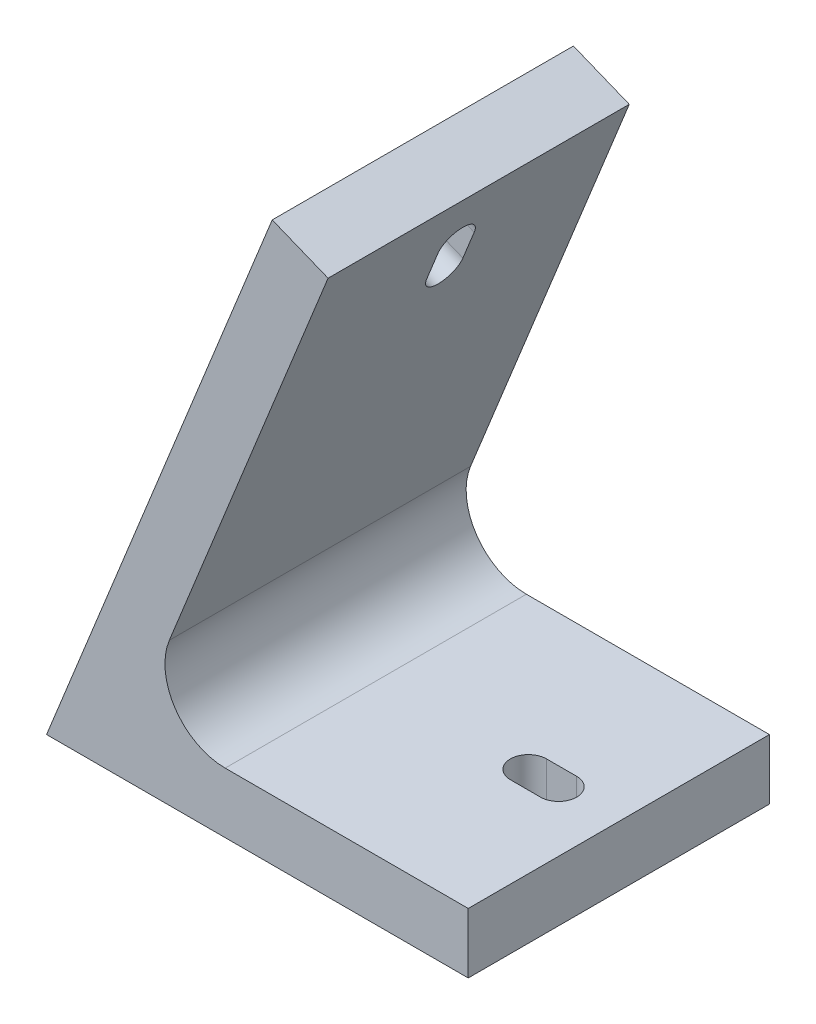
ISO-10303-21;
HEADER;
FILE_DESCRIPTION(('STEP AP214'),'2;1');
FILE_NAME('part.step','',(''),(''),'','','');
FILE_SCHEMA(('AUTOMOTIVE_DESIGN { 1 0 10303 214 1 1 1 1 }'));
ENDSEC;
DATA;
#1=APPLICATION_CONTEXT('core data for automotive mechanical design processes');
#2=APPLICATION_PROTOCOL_DEFINITION('international standard','automotive_design',2000,#1);
#3=PRODUCT_CONTEXT('',#1,'mechanical');
#4=PRODUCT('Part','Part','',(#3));
#5=PRODUCT_RELATED_PRODUCT_CATEGORY('part','',(#4));
#6=PRODUCT_DEFINITION_FORMATION('','',#4);
#7=PRODUCT_DEFINITION_CONTEXT('part definition',#1,'design');
#8=PRODUCT_DEFINITION('design','',#6,#7);
#9=PRODUCT_DEFINITION_SHAPE('','',#8);
#10=(LENGTH_UNIT() NAMED_UNIT(*) SI_UNIT(.MILLI.,.METRE.));
#11=(NAMED_UNIT(*) PLANE_ANGLE_UNIT() SI_UNIT($,.RADIAN.));
#12=(NAMED_UNIT(*) SI_UNIT($,.STERADIAN.) SOLID_ANGLE_UNIT());
#13=UNCERTAINTY_MEASURE_WITH_UNIT(LENGTH_MEASURE(1.E-05),#10,'distance_accuracy_value','');
#14=(GEOMETRIC_REPRESENTATION_CONTEXT(3) GLOBAL_UNCERTAINTY_ASSIGNED_CONTEXT((#13)) GLOBAL_UNIT_ASSIGNED_CONTEXT((#10,
#11,#12)) REPRESENTATION_CONTEXT('',''));
#15=CARTESIAN_POINT('',(0.,0.,0.));
#16=DIRECTION('',(0.,0.,1.));
#17=DIRECTION('',(1.,0.,0.));
#18=AXIS2_PLACEMENT_3D('',#15,#16,#17);
#19=CARTESIAN_POINT('',(0.,0.,25.));
#20=DIRECTION('',(0.,1.,0.));
#21=DIRECTION('',(0.,0.,1.));
#22=AXIS2_PLACEMENT_3D('',#19,#20,#21);
#23=PLANE('',#22);
#24=DIRECTION('',(1.,0.,0.));
#25=VECTOR('',#24,1.);
#26=CARTESIAN_POINT('',(60.,0.,3.));
#27=LINE('',#26,#25);
#28=CARTESIAN_POINT('',(55.,0.,3.));
#29=VERTEX_POINT('',#28);
#30=CARTESIAN_POINT('',(60.,0.,3.));
#31=VERTEX_POINT('',#30);
#32=EDGE_CURVE('E209',#29,#31,#27,.T.);
#33=ORIENTED_EDGE('',*,*,#32,.T.);
#34=CARTESIAN_POINT('',(60.,0.,0.));
#35=DIRECTION('',(0.,1.,0.));
#36=DIRECTION('',(-1.,0.,0.));
#37=AXIS2_PLACEMENT_3D('',#34,#35,#36);
#38=CIRCLE('',#37,3.);
#39=CARTESIAN_POINT('',(60.,0.,-3.));
#40=VERTEX_POINT('',#39);
#41=EDGE_CURVE('E196',#31,#40,#38,.T.);
#42=ORIENTED_EDGE('',*,*,#41,.T.);
#43=DIRECTION('',(-1.,0.,0.));
#44=VECTOR('',#43,1.);
#45=CARTESIAN_POINT('',(60.,0.,-3.));
#46=LINE('',#45,#44);
#47=CARTESIAN_POINT('',(55.,0.,-3.));
#48=VERTEX_POINT('',#47);
#49=EDGE_CURVE('E200',#40,#48,#46,.T.);
#50=ORIENTED_EDGE('',*,*,#49,.T.);
#51=CARTESIAN_POINT('',(55.,0.,0.));
#52=DIRECTION('',(0.,1.,0.));
#53=DIRECTION('',(-1.,0.,0.));
#54=AXIS2_PLACEMENT_3D('',#51,#52,#53);
#55=CIRCLE('',#54,3.);
#56=EDGE_CURVE('E205',#48,#29,#55,.T.);
#57=ORIENTED_EDGE('',*,*,#56,.T.);
#58=EDGE_LOOP('',(#33,#42,#50,#57));
#59=FACE_BOUND('',#58,.T.);
#60=DIRECTION('',(1.,0.,0.));
#61=VECTOR('',#60,1.);
#62=CARTESIAN_POINT('',(0.,0.,-25.));
#63=LINE('',#62,#61);
#64=CARTESIAN_POINT('',(0.,0.,-25.));
#65=VERTEX_POINT('',#64);
#66=CARTESIAN_POINT('',(70.,0.,-25.));
#67=VERTEX_POINT('',#66);
#68=EDGE_CURVE('E230',#65,#67,#63,.T.);
#69=ORIENTED_EDGE('',*,*,#68,.T.);
#70=DIRECTION('',(0.,0.,-1.));
#71=VECTOR('',#70,1.);
#72=CARTESIAN_POINT('',(70.,0.,25.));
#73=LINE('',#72,#71);
#74=CARTESIAN_POINT('',(70.,0.,25.));
#75=VERTEX_POINT('',#74);
#76=EDGE_CURVE('E293',#75,#67,#73,.T.);
#77=ORIENTED_EDGE('',*,*,#76,.F.);
#78=DIRECTION('',(1.,0.,0.));
#79=VECTOR('',#78,1.);
#80=CARTESIAN_POINT('',(0.,0.,25.));
#81=LINE('',#80,#79);
#82=CARTESIAN_POINT('',(0.,0.,25.));
#83=VERTEX_POINT('',#82);
#84=EDGE_CURVE('E240',#83,#75,#81,.T.);
#85=ORIENTED_EDGE('',*,*,#84,.F.);
#86=DIRECTION('',(0.,0.,-1.));
#87=VECTOR('',#86,1.);
#88=CARTESIAN_POINT('',(0.,0.,25.));
#89=LINE('',#88,#87);
#90=EDGE_CURVE('E260',#83,#65,#89,.T.);
#91=ORIENTED_EDGE('',*,*,#90,.T.);
#92=EDGE_LOOP('',(#69,#77,#85,#91));
#93=FACE_BOUND('',#92,.T.);
#94=ADVANCED_FACE('F45',(#59,#93),#23,.F.);
#95=CARTESIAN_POINT('',(70.,0.,25.));
#96=DIRECTION('',(-1.,0.,0.));
#97=DIRECTION('',(0.,0.,1.));
#98=AXIS2_PLACEMENT_3D('',#95,#96,#97);
#99=PLANE('',#98);
#100=DIRECTION('',(0.,1.,0.));
#101=VECTOR('',#100,1.);
#102=CARTESIAN_POINT('',(70.,0.,-25.));
#103=LINE('',#102,#101);
#104=CARTESIAN_POINT('',(70.,10.,-25.));
#105=VERTEX_POINT('',#104);
#106=EDGE_CURVE('E264',#67,#105,#103,.T.);
#107=ORIENTED_EDGE('',*,*,#106,.T.);
#108=DIRECTION('',(0.,0.,-1.));
#109=VECTOR('',#108,1.);
#110=CARTESIAN_POINT('',(70.,10.,25.));
#111=LINE('',#110,#109);
#112=CARTESIAN_POINT('',(70.,10.,25.));
#113=VERTEX_POINT('',#112);
#114=EDGE_CURVE('E289',#113,#105,#111,.T.);
#115=ORIENTED_EDGE('',*,*,#114,.F.);
#116=DIRECTION('',(0.,1.,0.));
#117=VECTOR('',#116,1.);
#118=CARTESIAN_POINT('',(70.,0.,25.));
#119=LINE('',#118,#117);
#120=EDGE_CURVE('E244',#75,#113,#119,.T.);
#121=ORIENTED_EDGE('',*,*,#120,.F.);
#122=ORIENTED_EDGE('',*,*,#76,.T.);
#123=EDGE_LOOP('',(#107,#115,#121,#122));
#124=FACE_BOUND('',#123,.T.);
#125=ADVANCED_FACE('F344',(#124),#99,.F.);
#126=CARTESIAN_POINT('',(70.,10.,25.));
#127=DIRECTION('',(0.,-1.,0.));
#128=DIRECTION('',(1.,0.,0.));
#129=AXIS2_PLACEMENT_3D('',#126,#127,#128);
#130=PLANE('',#129);
#131=DIRECTION('',(-1.,0.,0.));
#132=VECTOR('',#131,1.);
#133=CARTESIAN_POINT('',(60.,10.,-3.));
#134=LINE('',#133,#132);
#135=CARTESIAN_POINT('',(60.,10.,-3.));
#136=VERTEX_POINT('',#135);
#137=CARTESIAN_POINT('',(55.,10.,-3.));
#138=VERTEX_POINT('',#137);
#139=EDGE_CURVE('E216',#136,#138,#134,.T.);
#140=ORIENTED_EDGE('',*,*,#139,.F.);
#141=CARTESIAN_POINT('',(60.,10.,0.));
#142=DIRECTION('',(0.,1.,0.));
#143=DIRECTION('',(-1.,0.,0.));
#144=AXIS2_PLACEMENT_3D('',#141,#142,#143);
#145=CIRCLE('',#144,3.);
#146=CARTESIAN_POINT('',(60.,10.,3.));
#147=VERTEX_POINT('',#146);
#148=EDGE_CURVE('E191',#147,#136,#145,.T.);
#149=ORIENTED_EDGE('',*,*,#148,.F.);
#150=DIRECTION('',(1.,0.,0.));
#151=VECTOR('',#150,1.);
#152=CARTESIAN_POINT('',(60.,10.,3.));
#153=LINE('',#152,#151);
#154=CARTESIAN_POINT('',(55.,10.,3.));
#155=VERTEX_POINT('',#154);
#156=EDGE_CURVE('E201',#155,#147,#153,.T.);
#157=ORIENTED_EDGE('',*,*,#156,.F.);
#158=CARTESIAN_POINT('',(55.,10.,0.));
#159=DIRECTION('',(0.,1.,0.));
#160=DIRECTION('',(-1.,0.,0.));
#161=AXIS2_PLACEMENT_3D('',#158,#159,#160);
#162=CIRCLE('',#161,3.);
#163=EDGE_CURVE('E220',#138,#155,#162,.T.);
#164=ORIENTED_EDGE('',*,*,#163,.F.);
#165=EDGE_LOOP('',(#140,#149,#157,#164));
#166=FACE_BOUND('',#165,.T.);
#167=DIRECTION('',(-1.,0.,0.));
#168=VECTOR('',#167,1.);
#169=CARTESIAN_POINT('',(70.,10.,-25.));
#170=LINE('',#169,#168);
#171=CARTESIAN_POINT('',(29.6512193702549,9.99999999999999,-25.));
#172=VERTEX_POINT('',#171);
#173=EDGE_CURVE('E267',#105,#172,#170,.T.);
#174=ORIENTED_EDGE('',*,*,#173,.T.);
#175=DIRECTION('',(0.,0.,-1.));
#176=VECTOR('',#175,1.);
#177=CARTESIAN_POINT('',(29.6512193702549,9.99999999999999,25.));
#178=LINE('',#177,#176);
#179=CARTESIAN_POINT('',(29.6512193702549,9.99999999999999,25.));
#180=VERTEX_POINT('',#179);
#181=EDGE_CURVE('E61',#172,#180,#178,.F.);
#182=ORIENTED_EDGE('',*,*,#181,.T.);
#183=DIRECTION('',(-1.,0.,0.));
#184=VECTOR('',#183,1.);
#185=CARTESIAN_POINT('',(70.,10.,25.));
#186=LINE('',#185,#184);
#187=EDGE_CURVE('E248',#113,#180,#186,.T.);
#188=ORIENTED_EDGE('',*,*,#187,.F.);
#189=ORIENTED_EDGE('',*,*,#114,.T.);
#190=EDGE_LOOP('',(#174,#182,#188,#189));
#191=FACE_BOUND('',#190,.T.);
#192=ADVANCED_FACE('F351',(#166,#191),#130,.F.);
#193=CARTESIAN_POINT('',(14.8256096851274,9.99999999999999,25.));
#194=DIRECTION('',(-0.927183854566786,0.374606593415916,0.));
#195=DIRECTION('',(-0.374606593415916,-0.927183854566786,0.));
#196=AXIS2_PLACEMENT_3D('',#193,#194,#195);
#197=PLANE('',#196);
#198=DIRECTION('',(-0.374606593415917,-0.927183854566786,0.));
#199=VECTOR('',#198,1.);
#200=CARTESIAN_POINT('',(42.9864319531003,79.7004809768516,3.00000000000001));
#201=LINE('',#200,#199);
#202=CARTESIAN_POINT('',(42.9864319531003,79.7004809768516,3.));
#203=VERTEX_POINT('',#202);
#204=CARTESIAN_POINT('',(41.1133989860207,75.0645617040176,3.));
#205=VERTEX_POINT('',#204);
#206=EDGE_CURVE('E170',#203,#205,#201,.T.);
#207=ORIENTED_EDGE('',*,*,#206,.F.);
#208=CARTESIAN_POINT('',(42.9864319531003,79.7004809768516,0.));
#209=DIRECTION('',(0.927183854566786,-0.374606593415916,0.));
#210=DIRECTION('',(0.374606593415916,0.927183854566786,0.));
#211=AXIS2_PLACEMENT_3D('',#208,#209,#210);
#212=CIRCLE('',#211,3.);
#213=CARTESIAN_POINT('',(42.9864319531003,79.7004809768516,-3.));
#214=VERTEX_POINT('',#213);
#215=EDGE_CURVE('E176',#214,#203,#212,.T.);
#216=ORIENTED_EDGE('',*,*,#215,.F.);
#217=DIRECTION('',(0.374606593415917,0.927183854566786,0.));
#218=VECTOR('',#217,1.);
#219=CARTESIAN_POINT('',(42.9864319531003,79.7004809768516,-3.));
#220=LINE('',#219,#218);
#221=CARTESIAN_POINT('',(41.1133989860207,75.0645617040176,-3.));
#222=VERTEX_POINT('',#221);
#223=EDGE_CURVE('E181',#222,#214,#220,.T.);
#224=ORIENTED_EDGE('',*,*,#223,.F.);
#225=CARTESIAN_POINT('',(41.1133989860207,75.0645617040176,0.));
#226=DIRECTION('',(0.927183854566786,-0.374606593415916,0.));
#227=DIRECTION('',(0.374606593415916,0.927183854566786,0.));
#228=AXIS2_PLACEMENT_3D('',#225,#226,#227);
#229=CIRCLE('',#228,3.);
#230=EDGE_CURVE('E158',#205,#222,#229,.T.);
#231=ORIENTED_EDGE('',*,*,#230,.F.);
#232=EDGE_LOOP('',(#207,#216,#224,#231));
#233=FACE_BOUND('',#232,.T.);
#234=DIRECTION('',(0.374606593415916,0.927183854566786,0.));
#235=VECTOR('',#234,1.);
#236=CARTESIAN_POINT('',(14.8256096851274,9.99999999999999,25.));
#237=LINE('',#236,#235);
#238=CARTESIAN_POINT('',(20.3793808245871,23.7460659341592,25.));
#239=VERTEX_POINT('',#238);
#240=CARTESIAN_POINT('',(46.7324978872595,88.9723195225194,25.));
#241=VERTEX_POINT('',#240);
#242=EDGE_CURVE('E251',#239,#241,#237,.T.);
#243=ORIENTED_EDGE('',*,*,#242,.F.);
#244=DIRECTION('',(0.,0.,-1.));
#245=VECTOR('',#244,1.);
#246=CARTESIAN_POINT('',(20.3793808245871,23.7460659341592,-25.));
#247=LINE('',#246,#245);
#248=CARTESIAN_POINT('',(20.3793808245871,23.7460659341592,-25.));
#249=VERTEX_POINT('',#248);
#250=EDGE_CURVE('E310',#239,#249,#247,.T.);
#251=ORIENTED_EDGE('',*,*,#250,.T.);
#252=DIRECTION('',(0.374606593415916,0.927183854566786,0.));
#253=VECTOR('',#252,1.);
#254=CARTESIAN_POINT('',(14.8256096851274,9.99999999999999,-25.));
#255=LINE('',#254,#253);
#256=CARTESIAN_POINT('',(46.7324978872595,88.9723195225194,-25.));
#257=VERTEX_POINT('',#256);
#258=EDGE_CURVE('E270',#249,#257,#255,.T.);
#259=ORIENTED_EDGE('',*,*,#258,.T.);
#260=DIRECTION('',(0.,0.,-1.));
#261=VECTOR('',#260,1.);
#262=CARTESIAN_POINT('',(46.7324978872595,88.9723195225194,25.));
#263=LINE('',#262,#261);
#264=EDGE_CURVE('E285',#241,#257,#263,.T.);
#265=ORIENTED_EDGE('',*,*,#264,.F.);
#266=EDGE_LOOP('',(#243,#251,#259,#265));
#267=FACE_BOUND('',#266,.T.);
#268=ADVANCED_FACE('F178',(#233,#267),#197,.F.);
#269=CARTESIAN_POINT('',(46.7324978872595,88.9723195225194,25.));
#270=DIRECTION('',(-0.374606593415916,-0.927183854566786,0.));
#271=DIRECTION('',(0.927183854566786,-0.374606593415916,0.));
#272=AXIS2_PLACEMENT_3D('',#269,#270,#271);
#273=PLANE('',#272);
#274=DIRECTION('',(-0.927183854566786,0.374606593415916,0.));
#275=VECTOR('',#274,1.);
#276=CARTESIAN_POINT('',(46.7324978872595,88.9723195225194,-25.));
#277=LINE('',#276,#275);
#278=CARTESIAN_POINT('',(37.4606593415916,92.7183854566786,-25.));
#279=VERTEX_POINT('',#278);
#280=EDGE_CURVE('E273',#257,#279,#277,.T.);
#281=ORIENTED_EDGE('',*,*,#280,.T.);
#282=DIRECTION('',(0.,0.,-1.));
#283=VECTOR('',#282,1.);
#284=CARTESIAN_POINT('',(37.4606593415916,92.7183854566786,25.));
#285=LINE('',#284,#283);
#286=CARTESIAN_POINT('',(37.4606593415916,92.7183854566786,25.));
#287=VERTEX_POINT('',#286);
#288=EDGE_CURVE('E281',#287,#279,#285,.T.);
#289=ORIENTED_EDGE('',*,*,#288,.F.);
#290=DIRECTION('',(-0.927183854566786,0.374606593415916,0.));
#291=VECTOR('',#290,1.);
#292=CARTESIAN_POINT('',(46.7324978872595,88.9723195225194,25.));
#293=LINE('',#292,#291);
#294=EDGE_CURVE('E254',#241,#287,#293,.T.);
#295=ORIENTED_EDGE('',*,*,#294,.F.);
#296=ORIENTED_EDGE('',*,*,#264,.T.);
#297=EDGE_LOOP('',(#281,#289,#295,#296));
#298=FACE_BOUND('',#297,.T.);
#299=ADVANCED_FACE('F327',(#298),#273,.F.);
#300=CARTESIAN_POINT('',(0.,0.,25.));
#301=DIRECTION('',(0.927183854566786,-0.374606593415916,0.));
#302=DIRECTION('',(0.374606593415916,0.927183854566786,0.));
#303=AXIS2_PLACEMENT_3D('',#300,#301,#302);
#304=PLANE('',#303);
#305=DIRECTION('',(0.374606593415916,0.927183854566786,0.));
#306=VECTOR('',#305,1.);
#307=CARTESIAN_POINT('',(0.,0.,-3.00000000000001));
#308=LINE('',#307,#306);
#309=CARTESIAN_POINT('',(31.8415604403529,78.8106276381768,-3.));
#310=VERTEX_POINT('',#309);
#311=CARTESIAN_POINT('',(33.7145934074325,83.4465469110108,-3.));
#312=VERTEX_POINT('',#311);
#313=EDGE_CURVE('E302',#310,#312,#308,.T.);
#314=ORIENTED_EDGE('',*,*,#313,.T.);
#315=CARTESIAN_POINT('',(33.7145934074325,83.4465469110107,0.));
#316=DIRECTION('',(0.927183854566786,-0.374606593415916,0.));
#317=DIRECTION('',(0.374606593415916,0.927183854566786,0.));
#318=AXIS2_PLACEMENT_3D('',#315,#316,#317);
#319=CIRCLE('',#318,3.);
#320=CARTESIAN_POINT('',(33.7145934074325,83.4465469110108,3.00000000000001));
#321=VERTEX_POINT('',#320);
#322=EDGE_CURVE('E306',#312,#321,#319,.T.);
#323=ORIENTED_EDGE('',*,*,#322,.T.);
#324=DIRECTION('',(-0.374606593415916,-0.927183854566786,0.));
#325=VECTOR('',#324,1.);
#326=CARTESIAN_POINT('',(0.,0.,2.99999999999998));
#327=LINE('',#326,#325);
#328=CARTESIAN_POINT('',(31.8415604403529,78.8106276381768,3.));
#329=VERTEX_POINT('',#328);
#330=EDGE_CURVE('E297',#321,#329,#327,.T.);
#331=ORIENTED_EDGE('',*,*,#330,.T.);
#332=CARTESIAN_POINT('',(31.8415604403529,78.8106276381768,0.));
#333=DIRECTION('',(0.927183854566786,-0.374606593415916,0.));
#334=DIRECTION('',(0.374606593415916,0.927183854566786,0.));
#335=AXIS2_PLACEMENT_3D('',#332,#333,#334);
#336=CIRCLE('',#335,3.);
#337=EDGE_CURVE('E161',#329,#310,#336,.T.);
#338=ORIENTED_EDGE('',*,*,#337,.T.);
#339=EDGE_LOOP('',(#314,#323,#331,#338));
#340=FACE_BOUND('',#339,.T.);
#341=DIRECTION('',(-0.374606593415916,-0.927183854566786,0.));
#342=VECTOR('',#341,1.);
#343=CARTESIAN_POINT('',(0.,0.,-25.));
#344=LINE('',#343,#342);
#345=EDGE_CURVE('E245',#279,#65,#344,.T.);
#346=ORIENTED_EDGE('',*,*,#345,.T.);
#347=ORIENTED_EDGE('',*,*,#90,.F.);
#348=DIRECTION('',(-0.374606593415916,-0.927183854566786,0.));
#349=VECTOR('',#348,1.);
#350=CARTESIAN_POINT('',(0.,0.,25.));
#351=LINE('',#350,#349);
#352=EDGE_CURVE('E257',#287,#83,#351,.T.);
#353=ORIENTED_EDGE('',*,*,#352,.F.);
#354=ORIENTED_EDGE('',*,*,#288,.T.);
#355=EDGE_LOOP('',(#346,#347,#353,#354));
#356=FACE_BOUND('',#355,.T.);
#357=ADVANCED_FACE('F331',(#340,#356),#304,.F.);
#358=CARTESIAN_POINT('',(0.,0.,25.));
#359=DIRECTION('',(0.,0.,1.));
#360=DIRECTION('',(1.,0.,0.));
#361=AXIS2_PLACEMENT_3D('',#358,#359,#360);
#362=PLANE('',#361);
#363=ORIENTED_EDGE('',*,*,#84,.T.);
#364=ORIENTED_EDGE('',*,*,#120,.T.);
#365=ORIENTED_EDGE('',*,*,#187,.T.);
#366=CARTESIAN_POINT('',(29.6512193702549,20.,25.));
#367=DIRECTION('',(0.,0.,1.));
#368=DIRECTION('',(1.,0.,0.));
#369=AXIS2_PLACEMENT_3D('',#366,#367,#368);
#370=CIRCLE('',#369,10.);
#371=EDGE_CURVE('E11',#180,#239,#370,.F.);
#372=ORIENTED_EDGE('',*,*,#371,.T.);
#373=ORIENTED_EDGE('',*,*,#242,.T.);
#374=ORIENTED_EDGE('',*,*,#294,.T.);
#375=ORIENTED_EDGE('',*,*,#352,.T.);
#376=EDGE_LOOP('',(#363,#364,#365,#372,#373,#374,#375));
#377=FACE_BOUND('',#376,.T.);
#378=ADVANCED_FACE('F335',(#377),#362,.T.);
#379=CARTESIAN_POINT('',(0.,0.,-25.));
#380=DIRECTION('',(0.,0.,1.));
#381=DIRECTION('',(1.,0.,0.));
#382=AXIS2_PLACEMENT_3D('',#379,#380,#381);
#383=PLANE('',#382);
#384=ORIENTED_EDGE('',*,*,#68,.F.);
#385=ORIENTED_EDGE('',*,*,#345,.F.);
#386=ORIENTED_EDGE('',*,*,#280,.F.);
#387=ORIENTED_EDGE('',*,*,#258,.F.);
#388=CARTESIAN_POINT('',(29.6512193702549,20.,-25.));
#389=DIRECTION('',(0.,0.,1.));
#390=DIRECTION('',(1.,0.,0.));
#391=AXIS2_PLACEMENT_3D('',#388,#389,#390);
#392=CIRCLE('',#391,10.);
#393=EDGE_CURVE('E54',#249,#172,#392,.T.);
#394=ORIENTED_EDGE('',*,*,#393,.T.);
#395=ORIENTED_EDGE('',*,*,#173,.F.);
#396=ORIENTED_EDGE('',*,*,#106,.F.);
#397=EDGE_LOOP('',(#384,#385,#386,#387,#394,#395,#396));
#398=FACE_BOUND('',#397,.T.);
#399=ADVANCED_FACE('F323',(#398),#383,.F.);
#400=CARTESIAN_POINT('',(60.,0.,0.));
#401=DIRECTION('',(0.,1.,0.));
#402=DIRECTION('',(-1.,0.,0.));
#403=AXIS2_PLACEMENT_3D('',#400,#401,#402);
#404=CYLINDRICAL_SURFACE('',#403,3.);
#405=ORIENTED_EDGE('',*,*,#148,.T.);
#406=DIRECTION('',(0.,1.,0.));
#407=VECTOR('',#406,1.);
#408=CARTESIAN_POINT('',(60.,0.,-3.));
#409=LINE('',#408,#407);
#410=EDGE_CURVE('E213',#40,#136,#409,.T.);
#411=ORIENTED_EDGE('',*,*,#410,.F.);
#412=ORIENTED_EDGE('',*,*,#41,.F.);
#413=DIRECTION('',(0.,1.,0.));
#414=VECTOR('',#413,1.);
#415=CARTESIAN_POINT('',(60.,0.,3.));
#416=LINE('',#415,#414);
#417=EDGE_CURVE('E227',#31,#147,#416,.T.);
#418=ORIENTED_EDGE('',*,*,#417,.T.);
#419=EDGE_LOOP('',(#405,#411,#412,#418));
#420=FACE_BOUND('',#419,.T.);
#421=ADVANCED_FACE('F366',(#420),#404,.F.);
#422=CARTESIAN_POINT('',(60.,0.,3.));
#423=DIRECTION('',(0.,0.,1.));
#424=DIRECTION('',(1.,0.,0.));
#425=AXIS2_PLACEMENT_3D('',#422,#423,#424);
#426=PLANE('',#425);
#427=ORIENTED_EDGE('',*,*,#156,.T.);
#428=ORIENTED_EDGE('',*,*,#417,.F.);
#429=ORIENTED_EDGE('',*,*,#32,.F.);
#430=DIRECTION('',(0.,1.,0.));
#431=VECTOR('',#430,1.);
#432=CARTESIAN_POINT('',(55.,0.,3.));
#433=LINE('',#432,#431);
#434=EDGE_CURVE('E231',#29,#155,#433,.T.);
#435=ORIENTED_EDGE('',*,*,#434,.T.);
#436=EDGE_LOOP('',(#427,#428,#429,#435));
#437=FACE_BOUND('',#436,.T.);
#438=ADVANCED_FACE('F370',(#437),#426,.F.);
#439=CARTESIAN_POINT('',(55.,0.,0.));
#440=DIRECTION('',(0.,1.,0.));
#441=DIRECTION('',(-1.,0.,0.));
#442=AXIS2_PLACEMENT_3D('',#439,#440,#441);
#443=CYLINDRICAL_SURFACE('',#442,3.);
#444=ORIENTED_EDGE('',*,*,#163,.T.);
#445=ORIENTED_EDGE('',*,*,#434,.F.);
#446=ORIENTED_EDGE('',*,*,#56,.F.);
#447=DIRECTION('',(0.,1.,0.));
#448=VECTOR('',#447,1.);
#449=CARTESIAN_POINT('',(55.,0.,-3.));
#450=LINE('',#449,#448);
#451=EDGE_CURVE('E234',#48,#138,#450,.T.);
#452=ORIENTED_EDGE('',*,*,#451,.T.);
#453=EDGE_LOOP('',(#444,#445,#446,#452));
#454=FACE_BOUND('',#453,.T.);
#455=ADVANCED_FACE('F376',(#454),#443,.F.);
#456=CARTESIAN_POINT('',(60.,0.,-3.));
#457=DIRECTION('',(0.,0.,-1.));
#458=DIRECTION('',(-1.,0.,0.));
#459=AXIS2_PLACEMENT_3D('',#456,#457,#458);
#460=PLANE('',#459);
#461=ORIENTED_EDGE('',*,*,#139,.T.);
#462=ORIENTED_EDGE('',*,*,#451,.F.);
#463=ORIENTED_EDGE('',*,*,#49,.F.);
#464=ORIENTED_EDGE('',*,*,#410,.T.);
#465=EDGE_LOOP('',(#461,#462,#463,#464));
#466=FACE_BOUND('',#465,.T.);
#467=ADVANCED_FACE('F372',(#466),#460,.F.);
#468=CARTESIAN_POINT('',(1.5107921309694,96.4577271982857,0.));
#469=DIRECTION('',(0.927183854566786,-0.374606593415916,0.));
#470=DIRECTION('',(0.374606593415916,0.927183854566786,0.));
#471=AXIS2_PLACEMENT_3D('',#468,#469,#470);
#472=CYLINDRICAL_SURFACE('',#471,3.);
#473=DIRECTION('',(0.927183854566786,-0.374606593415916,0.));
#474=VECTOR('',#473,1.);
#475=CARTESIAN_POINT('',(1.5107921309694,96.4577271982857,-3.));
#476=LINE('',#475,#474);
#477=EDGE_CURVE('E188',#312,#214,#476,.T.);
#478=ORIENTED_EDGE('',*,*,#477,.T.);
#479=ORIENTED_EDGE('',*,*,#215,.T.);
#480=DIRECTION('',(0.927183854566786,-0.374606593415916,0.));
#481=VECTOR('',#480,1.);
#482=CARTESIAN_POINT('',(1.5107921309694,96.4577271982857,3.00000000000001));
#483=LINE('',#482,#481);
#484=EDGE_CURVE('E166',#321,#203,#483,.T.);
#485=ORIENTED_EDGE('',*,*,#484,.F.);
#486=ORIENTED_EDGE('',*,*,#322,.F.);
#487=EDGE_LOOP('',(#478,#479,#485,#486));
#488=FACE_BOUND('',#487,.T.);
#489=ADVANCED_FACE('F375',(#488),#472,.F.);
#490=CARTESIAN_POINT('',(1.5107921309694,96.4577271982857,-3.));
#491=DIRECTION('',(0.,0.,-1.));
#492=DIRECTION('',(0.,1.,0.));
#493=AXIS2_PLACEMENT_3D('',#490,#491,#492);
#494=PLANE('',#493);
#495=DIRECTION('',(0.927183854566786,-0.374606593415916,0.));
#496=VECTOR('',#495,1.);
#497=CARTESIAN_POINT('',(-0.362240836110188,91.8218079254518,-3.));
#498=LINE('',#497,#496);
#499=EDGE_CURVE('E165',#310,#222,#498,.T.);
#500=ORIENTED_EDGE('',*,*,#499,.T.);
#501=ORIENTED_EDGE('',*,*,#223,.T.);
#502=ORIENTED_EDGE('',*,*,#477,.F.);
#503=ORIENTED_EDGE('',*,*,#313,.F.);
#504=EDGE_LOOP('',(#500,#501,#502,#503));
#505=FACE_BOUND('',#504,.T.);
#506=ADVANCED_FACE('F385',(#505),#494,.F.);
#507=CARTESIAN_POINT('',(-0.362240836110188,91.8218079254518,0.));
#508=DIRECTION('',(0.927183854566786,-0.374606593415916,0.));
#509=DIRECTION('',(0.374606593415916,0.927183854566786,0.));
#510=AXIS2_PLACEMENT_3D('',#507,#508,#509);
#511=CYLINDRICAL_SURFACE('',#510,3.);
#512=DIRECTION('',(0.927183854566786,-0.374606593415916,0.));
#513=VECTOR('',#512,1.);
#514=CARTESIAN_POINT('',(-0.362240836110188,91.8218079254518,3.));
#515=LINE('',#514,#513);
#516=EDGE_CURVE('E153',#329,#205,#515,.T.);
#517=ORIENTED_EDGE('',*,*,#516,.T.);
#518=ORIENTED_EDGE('',*,*,#230,.T.);
#519=ORIENTED_EDGE('',*,*,#499,.F.);
#520=ORIENTED_EDGE('',*,*,#337,.F.);
#521=EDGE_LOOP('',(#517,#518,#519,#520));
#522=FACE_BOUND('',#521,.T.);
#523=ADVANCED_FACE('F155',(#522),#511,.F.);
#524=CARTESIAN_POINT('',(1.5107921309694,96.4577271982857,3.00000000000001));
#525=DIRECTION('',(0.,0.,1.));
#526=DIRECTION('',(0.,-1.,0.));
#527=AXIS2_PLACEMENT_3D('',#524,#525,#526);
#528=PLANE('',#527);
#529=ORIENTED_EDGE('',*,*,#484,.T.);
#530=ORIENTED_EDGE('',*,*,#206,.T.);
#531=ORIENTED_EDGE('',*,*,#516,.F.);
#532=ORIENTED_EDGE('',*,*,#330,.F.);
#533=EDGE_LOOP('',(#529,#530,#531,#532));
#534=FACE_BOUND('',#533,.T.);
#535=ADVANCED_FACE('F171',(#534),#528,.F.);
#536=CARTESIAN_POINT('',(29.6512193702549,20.,25.));
#537=DIRECTION('',(0.,0.,1.));
#538=DIRECTION('',(1.,0.,0.));
#539=AXIS2_PLACEMENT_3D('',#536,#537,#538);
#540=CYLINDRICAL_SURFACE('',#539,10.);
#541=ORIENTED_EDGE('',*,*,#371,.F.);
#542=ORIENTED_EDGE('',*,*,#181,.F.);
#543=ORIENTED_EDGE('',*,*,#393,.F.);
#544=ORIENTED_EDGE('',*,*,#250,.F.);
#545=EDGE_LOOP('',(#541,#542,#543,#544));
#546=FACE_BOUND('',#545,.T.);
#547=ADVANCED_FACE('F47',(#546),#540,.F.);
#548=CLOSED_SHELL('',(#94,#125,#192,#268,#299,#357,#378,#399,#421,#438,#455,#467,#489,#506,#523,
#535,#547));
#549=MANIFOLD_SOLID_BREP('B2',#548);
#550=ADVANCED_BREP_SHAPE_REPRESENTATION('',(#18,#549),#14);
#551=SHAPE_DEFINITION_REPRESENTATION(#9,#550);
ENDSEC;
END-ISO-10303-21;
